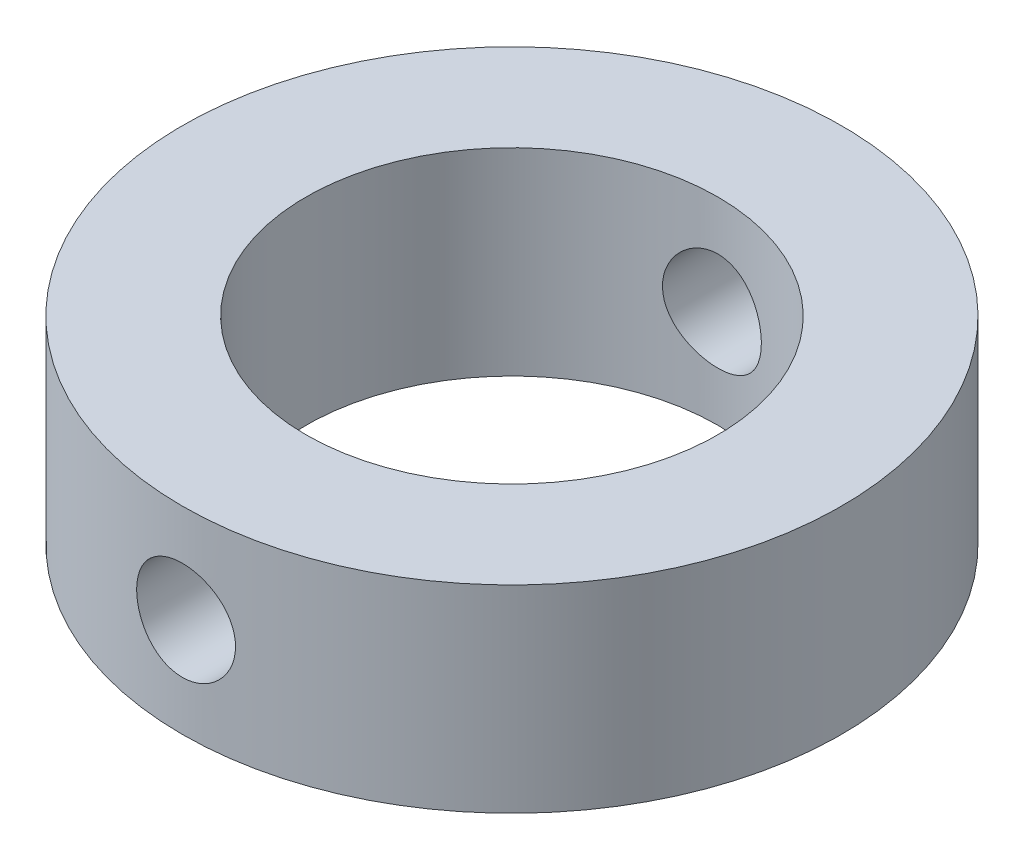
ISO-10303-21;
HEADER;
FILE_DESCRIPTION(('STEP AP214'),'2;1');
FILE_NAME('part.step','',(''),(''),'','','');
FILE_SCHEMA(('AUTOMOTIVE_DESIGN { 1 0 10303 214 1 1 1 1 }'));
ENDSEC;
DATA;
#1=APPLICATION_CONTEXT('core data for automotive mechanical design processes');
#2=APPLICATION_PROTOCOL_DEFINITION('international standard','automotive_design',2000,#1);
#3=PRODUCT_CONTEXT('',#1,'mechanical');
#4=PRODUCT('Part','Part','',(#3));
#5=PRODUCT_RELATED_PRODUCT_CATEGORY('part','',(#4));
#6=PRODUCT_DEFINITION_FORMATION('','',#4);
#7=PRODUCT_DEFINITION_CONTEXT('part definition',#1,'design');
#8=PRODUCT_DEFINITION('design','',#6,#7);
#9=PRODUCT_DEFINITION_SHAPE('','',#8);
#10=(LENGTH_UNIT() NAMED_UNIT(*) SI_UNIT(.MILLI.,.METRE.));
#11=(NAMED_UNIT(*) PLANE_ANGLE_UNIT() SI_UNIT($,.RADIAN.));
#12=(NAMED_UNIT(*) SI_UNIT($,.STERADIAN.) SOLID_ANGLE_UNIT());
#13=UNCERTAINTY_MEASURE_WITH_UNIT(LENGTH_MEASURE(1.E-05),#10,'distance_accuracy_value','');
#14=(GEOMETRIC_REPRESENTATION_CONTEXT(3) GLOBAL_UNCERTAINTY_ASSIGNED_CONTEXT((#13)) GLOBAL_UNIT_ASSIGNED_CONTEXT((#10,
#11,#12)) REPRESENTATION_CONTEXT('',''));
#15=CARTESIAN_POINT('',(0.,0.,0.));
#16=DIRECTION('',(0.,0.,1.));
#17=DIRECTION('',(1.,0.,0.));
#18=AXIS2_PLACEMENT_3D('',#15,#16,#17);
#19=CARTESIAN_POINT('',(0.,12.,0.));
#20=DIRECTION('',(0.,1.,0.));
#21=DIRECTION('',(0.,0.,1.));
#22=AXIS2_PLACEMENT_3D('',#19,#20,#21);
#23=PLANE('',#22);
#24=CARTESIAN_POINT('',(0.,12.,0.));
#25=DIRECTION('',(0.,1.,0.));
#26=DIRECTION('',(0.,0.,1.));
#27=AXIS2_PLACEMENT_3D('',#24,#25,#26);
#28=CIRCLE('',#27,20.);
#29=CARTESIAN_POINT('',(0.,12.,20.));
#30=VERTEX_POINT('',#29);
#31=EDGE_CURVE('E10',#30,#30,#28,.T.);
#32=ORIENTED_EDGE('',*,*,#31,.T.);
#33=EDGE_LOOP('',(#32));
#34=FACE_BOUND('',#33,.T.);
#35=CARTESIAN_POINT('',(0.,12.,0.));
#36=DIRECTION('',(0.,1.,0.));
#37=DIRECTION('',(0.,0.,1.));
#38=AXIS2_PLACEMENT_3D('',#35,#36,#37);
#39=CIRCLE('',#38,12.5);
#40=CARTESIAN_POINT('',(0.,12.,12.5));
#41=VERTEX_POINT('',#40);
#42=EDGE_CURVE('E50',#41,#41,#39,.T.);
#43=ORIENTED_EDGE('',*,*,#42,.F.);
#44=EDGE_LOOP('',(#43));
#45=FACE_BOUND('',#44,.T.);
#46=ADVANCED_FACE('F31',(#34,#45),#23,.T.);
#47=CARTESIAN_POINT('',(0.,0.,0.));
#48=DIRECTION('',(0.,1.,0.));
#49=DIRECTION('',(0.,0.,1.));
#50=AXIS2_PLACEMENT_3D('',#47,#48,#49);
#51=PLANE('',#50);
#52=CARTESIAN_POINT('',(0.,0.,0.));
#53=DIRECTION('',(0.,1.,0.));
#54=DIRECTION('',(0.,0.,1.));
#55=AXIS2_PLACEMENT_3D('',#52,#53,#54);
#56=CIRCLE('',#55,20.);
#57=CARTESIAN_POINT('',(0.,0.,20.));
#58=VERTEX_POINT('',#57);
#59=EDGE_CURVE('E45',#58,#58,#56,.T.);
#60=ORIENTED_EDGE('',*,*,#59,.F.);
#61=EDGE_LOOP('',(#60));
#62=FACE_BOUND('',#61,.T.);
#63=CARTESIAN_POINT('',(0.,0.,0.));
#64=DIRECTION('',(0.,1.,0.));
#65=DIRECTION('',(0.,0.,1.));
#66=AXIS2_PLACEMENT_3D('',#63,#64,#65);
#67=CIRCLE('',#66,12.5);
#68=CARTESIAN_POINT('',(0.,0.,12.5));
#69=VERTEX_POINT('',#68);
#70=EDGE_CURVE('E53',#69,#69,#67,.T.);
#71=ORIENTED_EDGE('',*,*,#70,.T.);
#72=EDGE_LOOP('',(#71));
#73=FACE_BOUND('',#72,.T.);
#74=ADVANCED_FACE('F89',(#62,#73),#51,.F.);
#75=CARTESIAN_POINT('',(0.,12.,0.));
#76=DIRECTION('',(0.,-1.,0.));
#77=DIRECTION('',(0.,0.,-1.));
#78=AXIS2_PLACEMENT_3D('',#75,#76,#77);
#79=CYLINDRICAL_SURFACE('',#78,20.);
#80=CARTESIAN_POINT('',(0.,9.,-20.));
#81=CARTESIAN_POINT('',(-0.167503088963284,8.99999309236952,-19.9999973154259));
#82=CARTESIAN_POINT('',(-0.335103370164263,8.98592399831873,-19.9978736507408));
#83=CARTESIAN_POINT('',(-0.665619255989826,8.9300336000345,-19.9896063194637));
#84=CARTESIAN_POINT('',(-0.828530137948458,8.88818527411021,-19.9834587387695));
#85=CARTESIAN_POINT('',(-1.14483617244372,8.77801499006475,-19.9678344243905));
#86=CARTESIAN_POINT('',(-1.2982384156536,8.7097130409881,-19.9583602074184));
#87=CARTESIAN_POINT('',(-1.59138085727051,8.54862324116627,-19.9371295182345));
#88=CARTESIAN_POINT('',(-1.73112294945038,8.45583879116528,-19.9253733630555));
#89=CARTESIAN_POINT('',(-1.99409343912425,8.24764547012025,-19.900783419829));
#90=CARTESIAN_POINT('',(-2.117199664451,8.13208308758359,-19.8879426778066));
#91=CARTESIAN_POINT('',(-2.34234981337897,7.88194462221226,-19.8626852226648));
#92=CARTESIAN_POINT('',(-2.44439252545871,7.74736744644296,-19.8502685339701));
#93=CARTESIAN_POINT('',(-2.62499458999886,7.46219871295502,-19.8271975491745));
#94=CARTESIAN_POINT('',(-2.7034357407441,7.31153150603733,-19.8165522395006));
#95=CARTESIAN_POINT('',(-2.83385264342112,6.99897435870915,-19.7983242261254));
#96=CARTESIAN_POINT('',(-2.88582983778326,6.83708503051222,-19.790741355509));
#97=CARTESIAN_POINT('',(-2.96146397597822,6.50796391625657,-19.7795651243735));
#98=CARTESIAN_POINT('',(-2.98533007281035,6.34078121318395,-19.775942314825));
#99=CARTESIAN_POINT('',(-3.00471248067865,6.00474766802544,-19.7730069794116));
#100=CARTESIAN_POINT('',(-3.00023041947592,5.83589692227501,-19.7736942060629));
#101=CARTESIAN_POINT('',(-2.96321466501575,5.50279783961172,-19.7792743670482));
#102=CARTESIAN_POINT('',(-2.93091391855501,5.3385229470304,-19.784132375231));
#103=CARTESIAN_POINT('',(-2.83954234807468,5.01775126225694,-19.7974521625273));
#104=CARTESIAN_POINT('',(-2.78047076675624,4.86125469023851,-19.8059140435876));
#105=CARTESIAN_POINT('',(-2.63699207059473,4.55977325743428,-19.8255267109096));
#106=CARTESIAN_POINT('',(-2.55248628566396,4.41483606181522,-19.8366879353305));
#107=CARTESIAN_POINT('',(-2.3606082625791,4.14111080843613,-19.860434151491));
#108=CARTESIAN_POINT('',(-2.25323452364956,4.01232381146126,-19.87301923665));
#109=CARTESIAN_POINT('',(-2.01738986156496,3.77320467852057,-19.8983494611242));
#110=CARTESIAN_POINT('',(-1.888718659284,3.66307001942732,-19.9110949422563));
#111=CARTESIAN_POINT('',(-1.61461417978837,3.46592813098548,-19.9351929529692));
#112=CARTESIAN_POINT('',(-1.46918082917634,3.37892100291221,-19.9465454764502));
#113=CARTESIAN_POINT('',(-1.16550919642737,3.23049382700091,-19.9665903117079));
#114=CARTESIAN_POINT('',(-1.00726335567356,3.16908901631941,-19.9752810385086));
#115=CARTESIAN_POINT('',(-0.682546364974121,3.07378122062925,-19.9890098111414));
#116=CARTESIAN_POINT('',(-0.516075771905201,3.03987637636885,-19.9940481039093));
#117=CARTESIAN_POINT('',(-0.181339135287293,3.00079354036661,-19.9998716226774));
#118=CARTESIAN_POINT('',(-0.0131054637409417,2.99534405724135,-20.0006970418078));
#119=CARTESIAN_POINT('',(0.321873355324565,3.01260601062205,-19.9981112203045));
#120=CARTESIAN_POINT('',(0.488618548763754,3.03531657533619,-19.9947001108274));
#121=CARTESIAN_POINT('',(0.815064774862816,3.10802820035508,-19.9840493723067));
#122=CARTESIAN_POINT('',(0.974795926159675,3.15789699206169,-19.9768283041597));
#123=CARTESIAN_POINT('',(1.283629917286,3.28336999492351,-19.9593647131674));
#124=CARTESIAN_POINT('',(1.4327322575902,3.35897541466726,-19.9491220484313));
#125=CARTESIAN_POINT('',(1.71726995858384,3.53441244912772,-19.9266536493737));
#126=CARTESIAN_POINT('',(1.85259801978313,3.63441628002554,-19.9144140325349));
#127=CARTESIAN_POINT('',(2.10464734635541,3.85557162325749,-19.8893572602433));
#128=CARTESIAN_POINT('',(2.22136752958681,3.9767243646493,-19.8765400712573));
#129=CARTESIAN_POINT('',(2.43387569914391,4.23794706635298,-19.8516452860899));
#130=CARTESIAN_POINT('',(2.52948169494842,4.37816585038953,-19.8395747203518));
#131=CARTESIAN_POINT('',(2.69578258541168,4.67283208102354,-19.8176643820981));
#132=CARTESIAN_POINT('',(2.76647815312872,4.82727914304293,-19.8078245493126));
#133=CARTESIAN_POINT('',(2.88066934647887,5.14547506724626,-19.7915406601729));
#134=CARTESIAN_POINT('',(2.92426074283271,5.30918892194248,-19.7850846601288));
#135=CARTESIAN_POINT('',(2.98331099003173,5.64171803087021,-19.776267645956));
#136=CARTESIAN_POINT('',(2.99877178366133,5.81053293198935,-19.7739063490354));
#137=CARTESIAN_POINT('',(3.0010757333888,6.14665812663156,-19.7735566522168));
#138=CARTESIAN_POINT('',(2.98820504334625,6.31396648351384,-19.77552452667));
#139=CARTESIAN_POINT('',(2.93482459088757,6.64401052664703,-19.7835164122235));
#140=CARTESIAN_POINT('',(2.89431487277254,6.80674622022678,-19.7895404168224));
#141=CARTESIAN_POINT('',(2.7869074703733,7.12294616446865,-19.8049505222459));
#142=CARTESIAN_POINT('',(2.72002978648628,7.27641734086687,-19.8143340743215));
#143=CARTESIAN_POINT('',(2.56181335284618,7.5700072676048,-19.835409091154));
#144=CARTESIAN_POINT('',(2.47047377483004,7.71012556560729,-19.8471006340545));
#145=CARTESIAN_POINT('',(2.26488675318328,7.97448611595034,-19.8716148672988));
#146=CARTESIAN_POINT('',(2.15042738079611,8.09856266649413,-19.8844473576393));
#147=CARTESIAN_POINT('',(1.90229768216567,8.32584910957565,-19.9097157765327));
#148=CARTESIAN_POINT('',(1.76862289670188,8.42905414515232,-19.9221516122152));
#149=CARTESIAN_POINT('',(1.48499141508745,8.61217535321473,-19.9453037158104));
#150=CARTESIAN_POINT('',(1.33494915352952,8.69196021842949,-19.9560101425764));
#151=CARTESIAN_POINT('',(1.02350374049744,8.82507703351609,-19.9744005760592));
#152=CARTESIAN_POINT('',(0.862112554193409,8.87843638010738,-19.9820877113151));
#153=CARTESIAN_POINT('',(0.583331455778659,8.94508268542021,-19.9918187852301));
#154=CARTESIAN_POINT('',(0.467662266990558,8.96564520307762,-19.9948709835911));
#155=CARTESIAN_POINT('',(0.234677943200251,8.99310619542529,-19.9989625189579));
#156=CARTESIAN_POINT('',(0.117362828668835,9.00000483990509,-20.0000018809755));
#157=CARTESIAN_POINT('',(0.,9.,-20.));
#158=B_SPLINE_CURVE_WITH_KNOTS('',3,(#80,#81,#82,#83,#84,#85,#86,#87,#88,#89,#90,#91,#92,#93,
#94,#95,#96,#97,#98,#99,#100,#101,#102,#103,#104,#105,#106,#107,#108,#109,#110,#111,#112,#113,
#114,#115,#116,#117,#118,#119,#120,#121,#122,#123,#124,#125,#126,#127,#128,#129,#130,#131,#132,
#133,#134,#135,#136,#137,#138,#139,#140,#141,#142,#143,#144,#145,#146,#147,#148,#149,#150,#151,
#152,#153,#154,#155,#156,#157),.UNSPECIFIED.,.T.,.F.,(4,2,2,2,2,2,2,2,2,2,2,2,2,2,2,2,2,2,2,2,2,
2,2,2,2,2,2,2,2,2,2,2,2,2,2,2,2,2,4),(0.,0.502080410063326,1.0046499258583,1.50684004716647,
2.0089604483952,2.51458832273687,3.0202452714516,3.5283940479075,4.03651512451012,
4.54083129211848,5.04511850197965,5.54522354391493,6.04534273380723,6.54742766952318,
7.04954556617068,7.55668582510817,8.06382830477336,8.57127217969749,9.07868174386802,
9.5812411708851,10.0837850398231,10.583902979319,11.0840444075255,11.5878237607381,
12.0916324005726,12.5996273316934,13.1076085361766,13.6137844691434,14.1199254427435,
14.6209777652213,15.1220292845913,15.6227014796829,16.1233906293376,16.6288965993144,
17.1345200693747,17.6429264676947,18.1508046652288,18.5025970395762,18.8543850424658),.UNSPECIFIED.);
#159=CARTESIAN_POINT('',(0.,9.,-20.));
#160=VERTEX_POINT('',#159);
#161=EDGE_CURVE('E78',#160,#160,#158,.T.);
#162=ORIENTED_EDGE('',*,*,#161,.T.);
#163=EDGE_LOOP('',(#162));
#164=FACE_BOUND('',#163,.T.);
#165=CARTESIAN_POINT('',(3.,6.,19.7737199332852));
#166=CARTESIAN_POINT('',(2.99999308214461,5.83250886140491,19.7737227330055));
#167=CARTESIAN_POINT('',(2.98592592776131,5.66492049845352,19.775871033033));
#168=CARTESIAN_POINT('',(2.93004393313153,5.33442937019211,19.7842262942551));
#169=CARTESIAN_POINT('',(2.88820202805161,5.17153133703171,19.7904372141437));
#170=CARTESIAN_POINT('',(2.77805052196486,4.85525248912088,19.8061987802088));
#171=CARTESIAN_POINT('',(2.70976123362879,4.70186447491962,19.8157468627605));
#172=CARTESIAN_POINT('',(2.54870126175497,4.4087459384519,19.8371038821332));
#173=CARTESIAN_POINT('',(2.45593394859721,4.26901353957035,19.8489125076385));
#174=CARTESIAN_POINT('',(2.2477580483714,4.0060323664924,19.8735657849959));
#175=CARTESIAN_POINT('',(2.13219211169647,3.8829087731868,19.8864172491706));
#176=CARTESIAN_POINT('',(1.88203921088869,3.65772502868871,19.9116473633715));
#177=CARTESIAN_POINT('',(1.74745120157304,3.55566603566594,19.9240259873698));
#178=CARTESIAN_POINT('',(1.46227271610551,3.37504673661735,19.9469869485662));
#179=CARTESIAN_POINT('',(1.31160845473154,3.2966016993551,19.9575603687121));
#180=CARTESIAN_POINT('',(0.999057700213945,3.16617680238363,19.9756441349274));
#181=CARTESIAN_POINT('',(0.837171800541354,3.11419554431421,19.9831546428387));
#182=CARTESIAN_POINT('',(0.508062246181141,3.03855322293833,19.9942182959558));
#183=CARTESIAN_POINT('',(0.340887768779734,3.01468254722567,19.9978007177469));
#184=CARTESIAN_POINT('',(0.00487040803895855,2.99528813035021,20.0007048953916));
#185=CARTESIAN_POINT('',(-0.163972382031492,2.99976281336062,20.0000268880988));
#186=CARTESIAN_POINT('',(-0.497103436401038,3.03676667552486,19.9945099932159));
#187=CARTESIAN_POINT('',(-0.661417382800014,3.06907034358297,19.9897045530496));
#188=CARTESIAN_POINT('',(-0.982265658286274,3.16046121264515,19.976510004557));
#189=CARTESIAN_POINT('',(-1.13879978702696,3.21954910300288,19.9681208039948));
#190=CARTESIAN_POINT('',(-1.44032756154063,3.36306199383419,19.9486438774641));
#191=CARTESIAN_POINT('',(-1.58527534464719,3.44758193021748,19.9375460703128));
#192=CARTESIAN_POINT('',(-1.85901581430035,3.63949038733997,19.9138887649084));
#193=CARTESIAN_POINT('',(-1.98780743654347,3.74688041341373,19.9013291704637));
#194=CARTESIAN_POINT('',(-2.22690896544529,3.98273689765318,19.8760031638525));
#195=CARTESIAN_POINT('',(-2.33702465901893,4.11140024394023,19.8632359324651));
#196=CARTESIAN_POINT('',(-2.53413198677626,4.38548215424747,19.8390540890705));
#197=CARTESIAN_POINT('',(-2.62112347855998,4.53090082143984,19.827639485393));
#198=CARTESIAN_POINT('',(-2.7695392906921,4.83456792588129,19.8074555057371));
#199=CARTESIAN_POINT('',(-2.83094364540163,4.99282626732478,19.7986881969058));
#200=CARTESIAN_POINT('',(-2.92624672417758,5.31757051029478,19.7848280579812));
#201=CARTESIAN_POINT('',(-2.96014738674652,5.4840558310935,19.779734968926));
#202=CARTESIAN_POINT('',(-2.99921440173311,5.81880017915497,19.7738490279005));
#203=CARTESIAN_POINT('',(-3.00465606530105,5.98702637640307,19.7730149760515));
#204=CARTESIAN_POINT('',(-2.98738114039638,6.32198838963467,19.7756321587431));
#205=CARTESIAN_POINT('',(-2.96466542564605,6.48872425170153,19.7790832603156));
#206=CARTESIAN_POINT('',(-2.89195405905533,6.81511963593126,19.7898440492291));
#207=CARTESIAN_POINT('',(-2.84209557055642,6.9748104098832,19.7971343296572));
#208=CARTESIAN_POINT('',(-2.71665663894173,7.28356818409721,19.8147360365154));
#209=CARTESIAN_POINT('',(-2.64107492552778,7.43263465925639,19.8250476121435));
#210=CARTESIAN_POINT('',(-2.46567355990647,7.71714652067008,19.8476271137413));
#211=CARTESIAN_POINT('',(-2.36567569123532,7.85248089455963,19.8599091855998));
#212=CARTESIAN_POINT('',(-2.14452833674403,8.10454571974762,19.8850031886671));
#213=CARTESIAN_POINT('',(-2.02337765489359,8.22127511836231,19.8978151498058));
#214=CARTESIAN_POINT('',(-1.76215123925637,8.43380521326717,19.9226541043477));
#215=CARTESIAN_POINT('',(-1.62192625354391,8.52942345648495,19.9346736692085));
#216=CARTESIAN_POINT('',(-1.32724416052736,8.69574581052528,19.9564581006403));
#217=CARTESIAN_POINT('',(-1.17278744272088,8.76645060293006,19.9662230288913));
#218=CARTESIAN_POINT('',(-0.854595991722294,8.88064748497606,19.9823653932159));
#219=CARTESIAN_POINT('',(-0.690897717508606,8.92423933415673,19.9887552343579));
#220=CARTESIAN_POINT('',(-0.358401631002386,8.98329575907494,19.997479533138));
#221=CARTESIAN_POINT('',(-0.189604156261159,8.99876219249828,19.9998142586162));
#222=CARTESIAN_POINT('',(0.146529181721631,9.00108340909881,20.0001625811827));
#223=CARTESIAN_POINT('',(0.313863140424088,8.98821736175398,19.9982183404754));
#224=CARTESIAN_POINT('',(0.643959590646226,8.93483722315846,19.9903122103834));
#225=CARTESIAN_POINT('',(0.806722096793076,8.89432322038277,19.9843503338553));
#226=CARTESIAN_POINT('',(1.12297874875927,8.78689624885963,19.9690757348472));
#227=CARTESIAN_POINT('',(1.27647958629737,8.72000260972253,19.9597654663314));
#228=CARTESIAN_POINT('',(1.5701222357934,8.56174502403332,19.9388166899175));
#229=CARTESIAN_POINT('',(1.71026361384214,8.47038028303784,19.9271781064349));
#230=CARTESIAN_POINT('',(1.97462517038319,8.26476460234314,19.9027302126952));
#231=CARTESIAN_POINT('',(2.09868413289002,8.1503075483729,19.8899109684125));
#232=CARTESIAN_POINT('',(2.32593616780809,7.90218985383348,19.8646200338864));
#233=CARTESIAN_POINT('',(2.42912433598991,7.76852471233049,19.8521484259231));
#234=CARTESIAN_POINT('',(2.61222621645125,7.4849020335527,19.8288896801826));
#235=CARTESIAN_POINT('',(2.69200588578924,7.334857166028,19.8181124016445));
#236=CARTESIAN_POINT('',(2.82511227740617,7.02340644654571,19.7995781807762));
#237=CARTESIAN_POINT('',(2.87846645148994,6.86201258430348,19.7918181058705));
#238=CARTESIAN_POINT('',(2.94509903780534,6.58324512747687,19.7819897106961));
#239=CARTESIAN_POINT('',(2.96565539560942,6.46759320614752,19.7789049876333));
#240=CARTESIAN_POINT('',(2.99310821153047,6.23464341653524,19.7747691313545));
#241=CARTESIAN_POINT('',(3.00000484670227,6.11734556960635,19.7737179717797));
#242=CARTESIAN_POINT('',(3.,6.,19.7737199332852));
#243=B_SPLINE_CURVE_WITH_KNOTS('',3,(#165,#166,#167,#168,#169,#170,#171,#172,#173,#174,#175,
#176,#177,#178,#179,#180,#181,#182,#183,#184,#185,#186,#187,#188,#189,#190,#191,#192,#193,#194,
#195,#196,#197,#198,#199,#200,#201,#202,#203,#204,#205,#206,#207,#208,#209,#210,#211,#212,#213,
#214,#215,#216,#217,#218,#219,#220,#221,#222,#223,#224,#225,#226,#227,#228,#229,#230,#231,#232,
#233,#234,#235,#236,#237,#238,#239,#240,#241,#242),.UNSPECIFIED.,.T.,.F.,(4,2,2,2,2,2,2,2,2,2,2,
2,2,2,2,2,2,2,2,2,2,2,2,2,2,2,2,2,2,2,2,2,2,2,2,2,2,2,4),(0.,0.502044503631428,1.00457893916572,
1.50672817071346,2.00880829736476,2.51448317302426,3.02018584419846,3.52831844215776,
4.03642418733213,4.54071665073005,5.04498107882959,5.54519725035667,6.04542629683014,
6.54754632777118,7.04969941902756,7.5567908933675,8.06388549032912,8.57137503550489,
9.07882880892893,9.58136429211699,10.0838841820405,10.5838878961896,11.0839163057645,
11.5877097200682,12.0915316292782,12.5995507551124,13.1075559814792,13.6136808178639,
14.1197722234516,14.6208992724886,15.1220247178986,15.6227836451988,16.1235588313842,
16.6290190002615,17.1345978047794,17.6430175765521,18.1509080689784,18.5026488378994,
18.854385047591),.UNSPECIFIED.);
#244=CARTESIAN_POINT('',(3.,6.,19.7737199332852));
#245=VERTEX_POINT('',#244);
#246=EDGE_CURVE('E73',#245,#245,#243,.T.);
#247=ORIENTED_EDGE('',*,*,#246,.T.);
#248=EDGE_LOOP('',(#247));
#249=FACE_BOUND('',#248,.T.);
#250=ORIENTED_EDGE('',*,*,#31,.F.);
#251=EDGE_LOOP('',(#250));
#252=FACE_BOUND('',#251,.T.);
#253=ORIENTED_EDGE('',*,*,#59,.T.);
#254=EDGE_LOOP('',(#253));
#255=FACE_BOUND('',#254,.T.);
#256=ADVANCED_FACE('F33',(#164,#249,#252,#255),#79,.T.);
#257=CARTESIAN_POINT('',(0.,12.,0.));
#258=DIRECTION('',(0.,-1.,0.));
#259=DIRECTION('',(0.,0.,-1.));
#260=AXIS2_PLACEMENT_3D('',#257,#258,#259);
#261=CYLINDRICAL_SURFACE('',#260,12.5);
#262=CARTESIAN_POINT('',(0.,9.,-12.5));
#263=CARTESIAN_POINT('',(-0.165963929028716,8.99999497592274,-12.4999970714968));
#264=CARTESIAN_POINT('',(-0.331985420928067,8.98618158976393,-12.4966615634859));
#265=CARTESIAN_POINT('',(-0.65928429097138,8.93136726040462,-12.4836783946933));
#266=CARTESIAN_POINT('',(-0.820558683214275,8.89034957200532,-12.4740268462166));
#267=CARTESIAN_POINT('',(-1.13358839471402,8.78250766549565,-12.4494823208195));
#268=CARTESIAN_POINT('',(-1.28535442324822,8.71571311014241,-12.4345953702841));
#269=CARTESIAN_POINT('',(-1.57552517879763,8.55831456355411,-12.4011725442513));
#270=CARTESIAN_POINT('',(-1.71392971475166,8.46771023192274,-12.3826366165873));
#271=CARTESIAN_POINT('',(-1.97609263393972,8.26343582162447,-12.3435386014785));
#272=CARTESIAN_POINT('',(-2.0995595210048,8.14939721895074,-12.3229472454311));
#273=CARTESIAN_POINT('',(-2.32581080811943,7.90228113093536,-12.2822574370147));
#274=CARTESIAN_POINT('',(-2.42859304624489,7.76920165795905,-12.2621590363612));
#275=CARTESIAN_POINT('',(-2.61189993555015,7.48555416698254,-12.224437969062));
#276=CARTESIAN_POINT('',(-2.69210377047565,7.33477341624116,-12.2068525815312));
#277=CARTESIAN_POINT('',(-2.82591582947333,7.02138016487152,-12.1765733412448));
#278=CARTESIAN_POINT('',(-2.87952794169564,6.85876939797685,-12.1638787734309));
#279=CARTESIAN_POINT('',(-2.95765058108663,6.5295234267311,-12.1451184675007));
#280=CARTESIAN_POINT('',(-2.98268262400616,6.36301887847449,-12.1389341034343));
#281=CARTESIAN_POINT('',(-3.00455808879087,6.02806762035724,-12.1335389605946));
#282=CARTESIAN_POINT('',(-3.00140571682399,5.85962120404308,-12.1343271412568));
#283=CARTESIAN_POINT('',(-2.96741912081942,5.52952403398712,-12.1426811387008));
#284=CARTESIAN_POINT('',(-2.93720103400494,5.36780543481044,-12.1500960921292));
#285=CARTESIAN_POINT('',(-2.85092141637188,5.05180268335216,-12.1706283738785));
#286=CARTESIAN_POINT('',(-2.79485817372027,4.89751902426557,-12.1837460799133));
#287=CARTESIAN_POINT('',(-2.65794121231782,4.59908702191564,-12.2143476734445));
#288=CARTESIAN_POINT('',(-2.5768594824696,4.45504754708331,-12.2318714325758));
#289=CARTESIAN_POINT('',(-2.39236688956383,4.18239549927742,-12.2692875046197));
#290=CARTESIAN_POINT('',(-2.28895240342647,4.05378543471489,-12.2891802016137));
#291=CARTESIAN_POINT('',(-2.05951493908847,3.81210642968126,-12.329732025739));
#292=CARTESIAN_POINT('',(-1.93297064389908,3.69953290093779,-12.3503975788014));
#293=CARTESIAN_POINT('',(-1.66255592459691,3.49711528025362,-12.3896951594929));
#294=CARTESIAN_POINT('',(-1.51868504982141,3.40727177970739,-12.4083271342049));
#295=CARTESIAN_POINT('',(-1.21702847718581,3.25270277938722,-12.4415394956922));
#296=CARTESIAN_POINT('',(-1.05920278696054,3.18805254376221,-12.4561077058019));
#297=CARTESIAN_POINT('',(-0.734497606078675,3.08633492095141,-12.4794620474154));
#298=CARTESIAN_POINT('',(-0.567619713387661,3.04926268237319,-12.4882491958651));
#299=CARTESIAN_POINT('',(-0.233787399651664,3.00449793534796,-12.4989027542709));
#300=CARTESIAN_POINT('',(-0.066928480545007,2.99613010753843,-12.5009282130753));
#301=CARTESIAN_POINT('',(0.26580438158663,3.0071667668509,-12.4982807419474));
#302=CARTESIAN_POINT('',(0.431678404764953,3.02656896198723,-12.4936083648176));
#303=CARTESIAN_POINT('',(0.755422580108848,3.09203697851638,-12.4781916395217));
#304=CARTESIAN_POINT('',(0.913370579311304,3.1377391095738,-12.4675301590363));
#305=CARTESIAN_POINT('',(1.21935330013476,3.25409819169527,-12.4413335015664));
#306=CARTESIAN_POINT('',(1.3673870666415,3.32475754297811,-12.4257978558334));
#307=CARTESIAN_POINT('',(1.6520615099557,3.49036659359785,-12.3911910149582));
#308=CARTESIAN_POINT('',(1.78847176740355,3.58570071692437,-12.3720653178033));
#309=CARTESIAN_POINT('',(2.04359904096632,3.79745692901341,-12.3324936406987));
#310=CARTESIAN_POINT('',(2.16231325074337,3.91388235608078,-12.3120474520734));
#311=CARTESIAN_POINT('',(2.38142453789941,4.16764083120855,-12.2715742142771));
#312=CARTESIAN_POINT('',(2.4813497404737,4.3053851220821,-12.2515669262669));
#313=CARTESIAN_POINT('',(2.65666020824081,4.59609042789673,-12.2147538797452));
#314=CARTESIAN_POINT('',(2.7320465722335,4.74905076109347,-12.1979479778962));
#315=CARTESIAN_POINT('',(2.85558993518171,5.06501251354399,-12.1696189519335));
#316=CARTESIAN_POINT('',(2.90390754385905,5.22794820342123,-12.1580647463107));
#317=CARTESIAN_POINT('',(2.97238380283979,5.55994618502069,-12.1415072663683));
#318=CARTESIAN_POINT('',(2.99254804274991,5.72900725376178,-12.1365026916888));
#319=CARTESIAN_POINT('',(3.00387066449353,6.0636707002806,-12.1337046220624));
#320=CARTESIAN_POINT('',(2.99578106592266,6.2292464963267,-12.1357241633848));
#321=CARTESIAN_POINT('',(2.95253345626267,6.55659976422369,-12.1463176460425));
#322=CARTESIAN_POINT('',(2.91737590900096,6.71837730111136,-12.1548914750658));
#323=CARTESIAN_POINT('',(2.82138591303537,7.03279755254825,-12.1775274976748));
#324=CARTESIAN_POINT('',(2.76068402045612,7.18548227258375,-12.191561756094));
#325=CARTESIAN_POINT('',(2.61543373580582,7.47860441388369,-12.2235433612686));
#326=CARTESIAN_POINT('',(2.53088229934855,7.61904026858636,-12.2414912075257));
#327=CARTESIAN_POINT('',(2.33793007708464,7.88733700011951,-12.2798193255291));
#328=CARTESIAN_POINT('',(2.22900267979018,8.01481232309873,-12.3002478697533));
#329=CARTESIAN_POINT('',(1.99143074773236,8.24991998805192,-12.3409359831145));
#330=CARTESIAN_POINT('',(1.86278158874234,8.35754766321024,-12.361195511444));
#331=CARTESIAN_POINT('',(1.5868829988014,8.55160925955475,-12.3996570299581));
#332=CARTESIAN_POINT('',(1.43936414359402,8.637668405442,-12.4178200201219));
#333=CARTESIAN_POINT('',(1.13153622828567,8.78362953274789,-12.4496380610582));
#334=CARTESIAN_POINT('',(0.971236973691221,8.84355134339162,-12.4632965272855));
#335=CARTESIAN_POINT('',(0.675887025694767,8.92603862513779,-12.4824059901497));
#336=CARTESIAN_POINT('',(0.542312066268423,8.9537166157857,-12.4889599449579));
#337=CARTESIAN_POINT('',(0.272504227478251,8.99069878085188,-12.4977580149525));
#338=CARTESIAN_POINT('',(0.136271517915777,9.00000412522552,-12.5000024045682));
#339=CARTESIAN_POINT('',(0.,9.,-12.5));
#340=B_SPLINE_CURVE_WITH_KNOTS('',3,(#262,#263,#264,#265,#266,#267,#268,#269,#270,#271,#272,
#273,#274,#275,#276,#277,#278,#279,#280,#281,#282,#283,#284,#285,#286,#287,#288,#289,#290,#291,
#292,#293,#294,#295,#296,#297,#298,#299,#300,#301,#302,#303,#304,#305,#306,#307,#308,#309,#310,
#311,#312,#313,#314,#315,#316,#317,#318,#319,#320,#321,#322,#323,#324,#325,#326,#327,#328,#329,
#330,#331,#332,#333,#334,#335,#336,#337,#338,#339),.UNSPECIFIED.,.T.,.F.,(4,2,2,2,2,2,2,2,2,2,2,
2,2,2,2,2,2,2,2,2,2,2,2,2,2,2,2,2,2,2,2,2,2,2,2,2,2,2,4),(0.,0.497392599366678,
0.995091645758824,1.49221966408501,1.98935478998519,2.49500570148357,3.00070943533306,
3.51327262050849,4.02576083835037,4.5287399535911,5.03164400680465,5.52338274964839,
6.01515406709138,6.51154667521171,7.00801987450003,7.51749958381934,8.0269925475217,
8.53799614678203,9.04890983140415,9.54771776810826,10.0464845383097,10.5385143736981,
11.0305915421211,11.5308523313794,12.031192370573,12.5427824523192,13.0543496229377,
13.5628484119093,14.0712462285018,14.5662165454702,15.0611783809799,15.5536406351284,
16.0461657803879,16.5505844610431,17.0551215958269,17.5678974206352,18.0802835459069,
18.4887142303991,18.897118905514),.UNSPECIFIED.);
#341=CARTESIAN_POINT('',(0.,9.,-12.5));
#342=VERTEX_POINT('',#341);
#343=EDGE_CURVE('E36',#342,#342,#340,.T.);
#344=ORIENTED_EDGE('',*,*,#343,.F.);
#345=EDGE_LOOP('',(#344));
#346=FACE_BOUND('',#345,.T.);
#347=CARTESIAN_POINT('',(3.,6.,12.1346610995116));
#348=CARTESIAN_POINT('',(2.99999492639599,5.83411368605636,12.1346643709057));
#349=CARTESIAN_POINT('',(2.98619401575549,5.66816969817757,12.1380998279897));
#350=CARTESIAN_POINT('',(2.93143372377318,5.34103164728038,12.1514386999622));
#351=CARTESIAN_POINT('',(2.89045727127241,5.17984063651202,12.1613461803941));
#352=CARTESIAN_POINT('',(2.78273587845348,4.86698770459709,12.1864438536979));
#353=CARTESIAN_POINT('',(2.71602252749926,4.71531436580599,12.2016275682829));
#354=CARTESIAN_POINT('',(2.55881551789466,4.42530045634281,12.2355589227549));
#355=CARTESIAN_POINT('',(2.46832134098417,4.28696017633045,12.2543066403104));
#356=CARTESIAN_POINT('',(2.26416092165145,4.02473118505982,12.2936793084446));
#357=CARTESIAN_POINT('',(2.15010136587795,3.90115284401048,12.3143323081787));
#358=CARTESIAN_POINT('',(1.90289576315871,3.67468460556583,12.3549444196641));
#359=CARTESIAN_POINT('',(1.7697480383165,3.57179652880738,12.3749034702238));
#360=CARTESIAN_POINT('',(1.48603435008244,3.38837356729399,12.4121875957975));
#361=CARTESIAN_POINT('',(1.33526735140698,3.30814147645071,12.429475709008));
#362=CARTESIAN_POINT('',(1.0219036434405,3.17427346268216,12.4591511096292));
#363=CARTESIAN_POINT('',(0.859308542342424,3.12063393185467,12.471539061815));
#364=CARTESIAN_POINT('',(0.530137152798909,3.04246184561352,12.4898200905274));
#365=CARTESIAN_POINT('',(0.363692527540999,3.01740278579179,12.4958305032045));
#366=CARTESIAN_POINT('',(0.0288605739758585,2.99545248030836,12.5010873481438));
#367=CARTESIAN_POINT('',(-0.139526485618309,2.99855738407585,12.5003347050497));
#368=CARTESIAN_POINT('',(-0.469819197188796,3.03246370078499,12.4922383642801));
#369=CARTESIAN_POINT('',(-0.631786969117105,3.06269708416856,12.4850298487431));
#370=CARTESIAN_POINT('',(-0.948279915829272,3.14909173796286,12.4649879597451));
#371=CARTESIAN_POINT('',(-1.10280471220598,3.20525432510285,12.4521543006312));
#372=CARTESIAN_POINT('',(-1.40154850796015,3.34238683274778,12.4220937673228));
#373=CARTESIAN_POINT('',(-1.54566890739797,3.42356325576841,12.4048305309056));
#374=CARTESIAN_POINT('',(-1.8184437481507,3.60826343366629,12.3677903650575));
#375=CARTESIAN_POINT('',(-1.94709568430374,3.71179080077329,12.3480130295253));
#376=CARTESIAN_POINT('',(-2.18866676072893,3.9413154010846,12.3075234545911));
#377=CARTESIAN_POINT('',(-2.30111257110785,4.06780936616896,12.2868002024656));
#378=CARTESIAN_POINT('',(-2.50329554889259,4.33807563615842,12.247210122564));
#379=CARTESIAN_POINT('',(-2.59303181841776,4.48184862390316,12.2283433682075));
#380=CARTESIAN_POINT('',(-2.74751986313759,4.78346525626311,12.1945661246798));
#381=CARTESIAN_POINT('',(-2.81216594132899,4.94136505107637,12.1796724534131));
#382=CARTESIAN_POINT('',(-2.91385324316721,5.26623312347683,12.155748323081));
#383=CARTESIAN_POINT('',(-2.95089985341171,5.43319962468333,12.1467167199581));
#384=CARTESIAN_POINT('',(-2.99556850234642,5.76709338006787,12.135777266023));
#385=CARTESIAN_POINT('',(-3.0038868332891,5.93392207251082,12.1337008786289));
#386=CARTESIAN_POINT('',(-2.99276203410493,6.2665831940748,12.1364495609797));
#387=CARTESIAN_POINT('',(-2.97332123871795,6.43241570580372,12.1412740503119));
#388=CARTESIAN_POINT('',(-2.90783852027801,6.75584591726093,12.1571201522343));
#389=CARTESIAN_POINT('',(-2.86219461484814,6.91352917591692,12.1680489760353));
#390=CARTESIAN_POINT('',(-2.74603914988784,7.21900782066707,12.1947857126682));
#391=CARTESIAN_POINT('',(-2.6755248260303,7.3668021054363,12.2105941678427));
#392=CARTESIAN_POINT('',(-2.51014743676234,7.65127875220396,12.2456689266469));
#393=CARTESIAN_POINT('',(-2.41486385815303,7.78770937400604,12.2649930224287));
#394=CARTESIAN_POINT('',(-2.2031905161038,8.04290073389391,12.3047764880024));
#395=CARTESIAN_POINT('',(-2.08679756812263,8.16165880098545,12.3252360287629));
#396=CARTESIAN_POINT('',(-1.8330286051264,8.38091500960924,12.3655511140332));
#397=CARTESIAN_POINT('',(-1.69523379949056,8.48093375598967,12.3853821651221));
#398=CARTESIAN_POINT('',(-1.40439761806721,8.65640846308503,12.4217193399952));
#399=CARTESIAN_POINT('',(-1.25135701785302,8.73186567244466,12.438225632785));
#400=CARTESIAN_POINT('',(-0.935406182533392,8.85544747727503,12.4659520953338));
#401=CARTESIAN_POINT('',(-0.77257373203352,8.90376232052163,12.4772089625634));
#402=CARTESIAN_POINT('',(-0.440797516621207,8.97226782039686,12.4933282808784));
#403=CARTESIAN_POINT('',(-0.271854838350954,8.99246345275549,12.4981918632553));
#404=CARTESIAN_POINT('',(0.0628273325379101,9.00389586778703,12.5009346170348));
#405=CARTESIAN_POINT('',(0.228541548592052,8.9958427559416,12.4989850590467));
#406=CARTESIAN_POINT('',(0.556181588106274,8.95262003698245,12.4886960978661));
#407=CARTESIAN_POINT('',(0.718107508375787,8.91745112359129,12.4803568581455));
#408=CARTESIAN_POINT('',(1.03289533638029,8.8213631748843,12.4582475403262));
#409=CARTESIAN_POINT('',(1.18579554017999,8.76056343055918,12.4445026408745));
#410=CARTESIAN_POINT('',(1.47930912419136,8.6150497558514,12.4130357959962));
#411=CARTESIAN_POINT('',(1.61992106367531,8.53033302625372,12.3953133850962));
#412=CARTESIAN_POINT('',(1.88826701153781,8.33717452572309,12.3573152907204));
#413=CARTESIAN_POINT('',(2.01564306622629,8.22824492925642,12.3369914041701));
#414=CARTESIAN_POINT('',(2.25054951565269,7.99071238941027,12.2963112747441));
#415=CARTESIAN_POINT('',(2.35807496614236,7.86210455926369,12.2759550250775));
#416=CARTESIAN_POINT('',(2.5519948518568,7.58626060583986,12.2371275634283));
#417=CARTESIAN_POINT('',(2.63800316633774,7.438747379493,12.2186938455572));
#418=CARTESIAN_POINT('',(2.78387070894251,7.13093815349446,12.1862909651906));
#419=CARTESIAN_POINT('',(2.84375002144869,6.97065208432893,12.1723183758181));
#420=CARTESIAN_POINT('',(2.92614436386637,6.67540714648592,12.1527391085338));
#421=CARTESIAN_POINT('',(2.95378236710749,6.5419291717888,12.1460087939348));
#422=CARTESIAN_POINT('',(2.99071161192546,6.2723136259292,12.1369686046644));
#423=CARTESIAN_POINT('',(3.00000416492674,6.13617624557697,12.1346584140208));
#424=CARTESIAN_POINT('',(3.,6.,12.1346610995116));
#425=B_SPLINE_CURVE_WITH_KNOTS('',3,(#347,#348,#349,#350,#351,#352,#353,#354,#355,#356,#357,
#358,#359,#360,#361,#362,#363,#364,#365,#366,#367,#368,#369,#370,#371,#372,#373,#374,#375,#376,
#377,#378,#379,#380,#381,#382,#383,#384,#385,#386,#387,#388,#389,#390,#391,#392,#393,#394,#395,
#396,#397,#398,#399,#400,#401,#402,#403,#404,#405,#406,#407,#408,#409,#410,#411,#412,#413,#414,
#415,#416,#417,#418,#419,#420,#421,#422,#423,#424),.UNSPECIFIED.,.T.,.F.,(4,2,2,2,2,2,2,2,2,2,2,
2,2,2,2,2,2,2,2,2,2,2,2,2,2,2,2,2,2,2,2,2,2,2,2,2,2,2,4),(0.,0.497159212189432,0.9946310265389,
1.49149417875254,1.98836816009861,2.49432418194046,3.00032470584734,3.51279830766303,
4.02520236141813,4.52800628486068,5.03074146609936,5.52318961529222,6.01566277459448,
6.51231571921414,7.00904899016388,7.51819168467208,8.02735450631452,8.5386395722652,
9.04982482437227,9.54852995993759,10.047193153326,10.5384749824062,11.0298114342859,
11.5301065260645,12.0304771548043,12.5422844123508,13.0540656468818,13.5622134292334,
14.0702712827588,14.5656502933719,15.0610166307768,15.5541024543049,16.047246011943,
16.5514085771014,17.0556965465884,17.56847227941,18.0808531634825,18.4890008491296,
18.8971193572843),.UNSPECIFIED.);
#426=CARTESIAN_POINT('',(3.,6.,12.1346610995116));
#427=VERTEX_POINT('',#426);
#428=EDGE_CURVE('E55',#427,#427,#425,.T.);
#429=ORIENTED_EDGE('',*,*,#428,.F.);
#430=EDGE_LOOP('',(#429));
#431=FACE_BOUND('',#430,.T.);
#432=ORIENTED_EDGE('',*,*,#42,.T.);
#433=EDGE_LOOP('',(#432));
#434=FACE_BOUND('',#433,.T.);
#435=ORIENTED_EDGE('',*,*,#70,.F.);
#436=EDGE_LOOP('',(#435));
#437=FACE_BOUND('',#436,.T.);
#438=ADVANCED_FACE('F60',(#346,#431,#434,#437),#261,.F.);
#439=CARTESIAN_POINT('',(0.,6.,-42.));
#440=DIRECTION('',(0.,0.,1.));
#441=DIRECTION('',(1.,0.,0.));
#442=AXIS2_PLACEMENT_3D('',#439,#440,#441);
#443=CYLINDRICAL_SURFACE('',#442,3.);
#444=ORIENTED_EDGE('',*,*,#428,.T.);
#445=EDGE_LOOP('',(#444));
#446=FACE_BOUND('',#445,.T.);
#447=ORIENTED_EDGE('',*,*,#246,.F.);
#448=EDGE_LOOP('',(#447));
#449=FACE_BOUND('',#448,.T.);
#450=ADVANCED_FACE('F66',(#446,#449),#443,.F.);
#451=ORIENTED_EDGE('',*,*,#343,.T.);
#452=EDGE_LOOP('',(#451));
#453=FACE_BOUND('',#452,.T.);
#454=ORIENTED_EDGE('',*,*,#161,.F.);
#455=EDGE_LOOP('',(#454));
#456=FACE_BOUND('',#455,.T.);
#457=ADVANCED_FACE('F63',(#453,#456),#443,.F.);
#458=CLOSED_SHELL('',(#46,#74,#256,#438,#450,#457));
#459=MANIFOLD_SOLID_BREP('B2',#458);
#460=ADVANCED_BREP_SHAPE_REPRESENTATION('',(#18,#459),#14);
#461=SHAPE_DEFINITION_REPRESENTATION(#9,#460);
ENDSEC;
END-ISO-10303-21;
